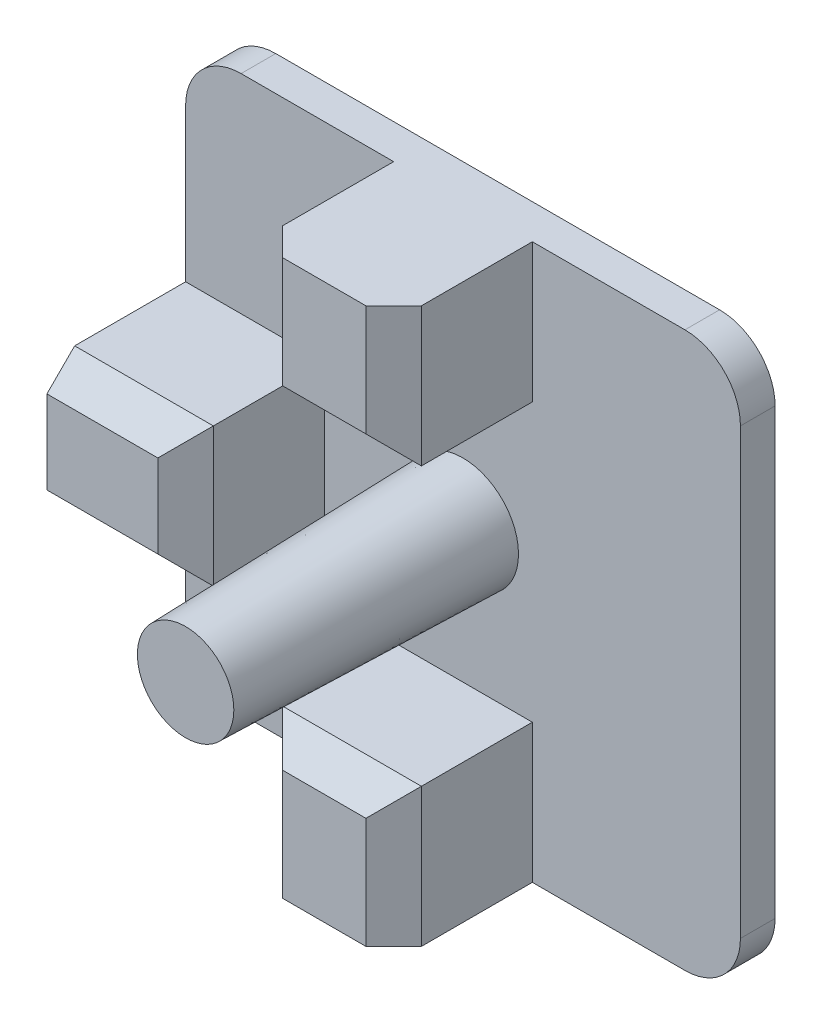
ISO-10303-21;
HEADER;
FILE_DESCRIPTION(('STEP AP214'),'2;1');
FILE_NAME('part.step','',(''),(''),'','','');
FILE_SCHEMA(('AUTOMOTIVE_DESIGN { 1 0 10303 214 1 1 1 1 }'));
ENDSEC;
DATA;
#1=APPLICATION_CONTEXT('core data for automotive mechanical design processes');
#2=APPLICATION_PROTOCOL_DEFINITION('international standard','automotive_design',2000,#1);
#3=PRODUCT_CONTEXT('',#1,'mechanical');
#4=PRODUCT('Part','Part','',(#3));
#5=PRODUCT_RELATED_PRODUCT_CATEGORY('part','',(#4));
#6=PRODUCT_DEFINITION_FORMATION('','',#4);
#7=PRODUCT_DEFINITION_CONTEXT('part definition',#1,'design');
#8=PRODUCT_DEFINITION('design','',#6,#7);
#9=PRODUCT_DEFINITION_SHAPE('','',#8);
#10=(LENGTH_UNIT() NAMED_UNIT(*) SI_UNIT(.MILLI.,.METRE.));
#11=(NAMED_UNIT(*) PLANE_ANGLE_UNIT() SI_UNIT($,.RADIAN.));
#12=(NAMED_UNIT(*) SI_UNIT($,.STERADIAN.) SOLID_ANGLE_UNIT());
#13=UNCERTAINTY_MEASURE_WITH_UNIT(LENGTH_MEASURE(1.E-05),#10,'distance_accuracy_value','');
#14=(GEOMETRIC_REPRESENTATION_CONTEXT(3) GLOBAL_UNCERTAINTY_ASSIGNED_CONTEXT((#13)) GLOBAL_UNIT_ASSIGNED_CONTEXT((#10,
#11,#12)) REPRESENTATION_CONTEXT('',''));
#15=CARTESIAN_POINT('',(0.,0.,0.));
#16=DIRECTION('',(0.,0.,1.));
#17=DIRECTION('',(1.,0.,0.));
#18=AXIS2_PLACEMENT_3D('',#15,#16,#17);
#19=CARTESIAN_POINT('',(10.16,-10.16,1.5875));
#20=DIRECTION('',(0.,0.,1.));
#21=DIRECTION('',(1.,0.,0.));
#22=AXIS2_PLACEMENT_3D('',#19,#20,#21);
#23=PLANE('',#22);
#24=CARTESIAN_POINT('',(0.,0.,1.5875));
#25=DIRECTION('',(0.,0.,1.));
#26=DIRECTION('',(1.,0.,0.));
#27=AXIS2_PLACEMENT_3D('',#24,#25,#26);
#28=CIRCLE('',#27,2.54);
#29=CARTESIAN_POINT('',(2.54,0.,1.5875));
#30=VERTEX_POINT('',#29);
#31=EDGE_CURVE('E248',#30,#30,#28,.T.);
#32=ORIENTED_EDGE('',*,*,#31,.F.);
#33=EDGE_LOOP('',(#32));
#34=FACE_BOUND('',#33,.T.);
#35=DIRECTION('',(1.,0.,0.));
#36=VECTOR('',#35,1.);
#37=CARTESIAN_POINT('',(-2.54136989230612E-13,6.35000000000014,1.5875));
#38=LINE('',#37,#36);
#39=CARTESIAN_POINT('',(-3.17499999999998,6.35000000000002,1.5875));
#40=VERTEX_POINT('',#39);
#41=CARTESIAN_POINT('',(3.17499999999991,6.35000000000027,1.5875));
#42=VERTEX_POINT('',#41);
#43=EDGE_CURVE('E242',#40,#42,#38,.T.);
#44=ORIENTED_EDGE('',*,*,#43,.F.);
#45=DIRECTION('',(0.,-1.,0.));
#46=VECTOR('',#45,1.);
#47=CARTESIAN_POINT('',(-3.17499999999987,0.,1.5875));
#48=LINE('',#47,#46);
#49=CARTESIAN_POINT('',(-3.17500000000003,12.7,1.5875));
#50=VERTEX_POINT('',#49);
#51=EDGE_CURVE('E220',#50,#40,#48,.T.);
#52=ORIENTED_EDGE('',*,*,#51,.F.);
#53=DIRECTION('',(-1.,0.,0.));
#54=VECTOR('',#53,1.);
#55=CARTESIAN_POINT('',(-10.16,12.7,1.5875));
#56=LINE('',#55,#54);
#57=CARTESIAN_POINT('',(-10.16,12.7,1.5875));
#58=VERTEX_POINT('',#57);
#59=EDGE_CURVE('E229',#50,#58,#56,.T.);
#60=ORIENTED_EDGE('',*,*,#59,.T.);
#61=CARTESIAN_POINT('',(-10.16,10.16,1.5875));
#62=DIRECTION('',(0.,0.,1.));
#63=DIRECTION('',(1.,0.,0.));
#64=AXIS2_PLACEMENT_3D('',#61,#62,#63);
#65=CIRCLE('',#64,2.54);
#66=CARTESIAN_POINT('',(-12.7,10.16,1.5875));
#67=VERTEX_POINT('',#66);
#68=EDGE_CURVE('E308',#58,#67,#65,.T.);
#69=ORIENTED_EDGE('',*,*,#68,.T.);
#70=DIRECTION('',(0.,-1.,0.));
#71=VECTOR('',#70,1.);
#72=CARTESIAN_POINT('',(-12.7,10.16,1.5875));
#73=LINE('',#72,#71);
#74=CARTESIAN_POINT('',(-12.7,3.175,1.5875));
#75=VERTEX_POINT('',#74);
#76=EDGE_CURVE('E311',#67,#75,#73,.T.);
#77=ORIENTED_EDGE('',*,*,#76,.T.);
#78=DIRECTION('',(-1.,0.,0.));
#79=VECTOR('',#78,1.);
#80=CARTESIAN_POINT('',(0.,3.175,1.5875));
#81=LINE('',#80,#79);
#82=CARTESIAN_POINT('',(-6.35,3.175,1.5875));
#83=VERTEX_POINT('',#82);
#84=EDGE_CURVE('E267',#83,#75,#81,.T.);
#85=ORIENTED_EDGE('',*,*,#84,.F.);
#86=DIRECTION('',(0.,1.,0.));
#87=VECTOR('',#86,1.);
#88=CARTESIAN_POINT('',(-6.35,0.,1.5875));
#89=LINE('',#88,#87);
#90=CARTESIAN_POINT('',(-6.35,-3.175,1.5875));
#91=VERTEX_POINT('',#90);
#92=EDGE_CURVE('E225',#91,#83,#89,.T.);
#93=ORIENTED_EDGE('',*,*,#92,.F.);
#94=DIRECTION('',(1.,0.,0.));
#95=VECTOR('',#94,1.);
#96=CARTESIAN_POINT('',(0.,-3.175,1.5875));
#97=LINE('',#96,#95);
#98=CARTESIAN_POINT('',(-12.7,-3.175,1.5875));
#99=VERTEX_POINT('',#98);
#100=EDGE_CURVE('E264',#99,#91,#97,.T.);
#101=ORIENTED_EDGE('',*,*,#100,.F.);
#102=CARTESIAN_POINT('',(-12.7,-10.16,1.5875));
#103=VERTEX_POINT('',#102);
#104=EDGE_CURVE('E310',#99,#103,#73,.T.);
#105=ORIENTED_EDGE('',*,*,#104,.T.);
#106=CARTESIAN_POINT('',(-10.16,-10.16,1.5875));
#107=DIRECTION('',(0.,0.,1.));
#108=DIRECTION('',(1.,0.,0.));
#109=AXIS2_PLACEMENT_3D('',#106,#107,#108);
#110=CIRCLE('',#109,2.54);
#111=CARTESIAN_POINT('',(-10.16,-12.7,1.5875));
#112=VERTEX_POINT('',#111);
#113=EDGE_CURVE('E314',#103,#112,#110,.T.);
#114=ORIENTED_EDGE('',*,*,#113,.T.);
#115=DIRECTION('',(1.,0.,0.));
#116=VECTOR('',#115,1.);
#117=CARTESIAN_POINT('',(-10.16,-12.7,1.5875));
#118=LINE('',#117,#116);
#119=CARTESIAN_POINT('',(-3.17499999999973,-12.7,1.5875));
#120=VERTEX_POINT('',#119);
#121=EDGE_CURVE('E317',#112,#120,#118,.T.);
#122=ORIENTED_EDGE('',*,*,#121,.T.);
#123=DIRECTION('',(0.,-1.,0.));
#124=VECTOR('',#123,1.);
#125=CARTESIAN_POINT('',(-3.17499999999973,0.,1.5875));
#126=LINE('',#125,#124);
#127=CARTESIAN_POINT('',(-3.17499999999973,-6.34999999999992,1.5875));
#128=VERTEX_POINT('',#127);
#129=EDGE_CURVE('E284',#128,#120,#126,.T.);
#130=ORIENTED_EDGE('',*,*,#129,.F.);
#131=DIRECTION('',(-1.,0.,0.));
#132=VECTOR('',#131,1.);
#133=CARTESIAN_POINT('',(0.,-6.34999999999992,1.5875));
#134=LINE('',#133,#132);
#135=CARTESIAN_POINT('',(3.17500000000027,-6.34999999999992,1.5875));
#136=VERTEX_POINT('',#135);
#137=EDGE_CURVE('E287',#136,#128,#134,.T.);
#138=ORIENTED_EDGE('',*,*,#137,.F.);
#139=DIRECTION('',(0.,1.,0.));
#140=VECTOR('',#139,1.);
#141=CARTESIAN_POINT('',(3.17500000000027,0.,1.5875));
#142=LINE('',#141,#140);
#143=CARTESIAN_POINT('',(3.17500000000027,-12.7,1.5875));
#144=VERTEX_POINT('',#143);
#145=EDGE_CURVE('E279',#144,#136,#142,.T.);
#146=ORIENTED_EDGE('',*,*,#145,.F.);
#147=CARTESIAN_POINT('',(10.16,-12.7,1.5875));
#148=VERTEX_POINT('',#147);
#149=EDGE_CURVE('E316',#144,#148,#118,.T.);
#150=ORIENTED_EDGE('',*,*,#149,.T.);
#151=CARTESIAN_POINT('',(10.16,-10.16,1.5875));
#152=DIRECTION('',(0.,0.,1.));
#153=DIRECTION('',(1.,0.,0.));
#154=AXIS2_PLACEMENT_3D('',#151,#152,#153);
#155=CIRCLE('',#154,2.54);
#156=CARTESIAN_POINT('',(12.7,-10.16,1.5875));
#157=VERTEX_POINT('',#156);
#158=EDGE_CURVE('E300',#148,#157,#155,.T.);
#159=ORIENTED_EDGE('',*,*,#158,.T.);
#160=DIRECTION('',(0.,1.,0.));
#161=VECTOR('',#160,1.);
#162=CARTESIAN_POINT('',(12.7,10.16,1.5875));
#163=LINE('',#162,#161);
#164=CARTESIAN_POINT('',(12.7,10.16,1.5875));
#165=VERTEX_POINT('',#164);
#166=EDGE_CURVE('E303',#157,#165,#163,.T.);
#167=ORIENTED_EDGE('',*,*,#166,.T.);
#168=CARTESIAN_POINT('',(10.16,10.16,1.5875));
#169=DIRECTION('',(0.,0.,1.));
#170=DIRECTION('',(-1.,0.,0.));
#171=AXIS2_PLACEMENT_3D('',#168,#169,#170);
#172=CIRCLE('',#171,2.54);
#173=CARTESIAN_POINT('',(10.16,12.7,1.5875));
#174=VERTEX_POINT('',#173);
#175=EDGE_CURVE('E237',#165,#174,#172,.T.);
#176=ORIENTED_EDGE('',*,*,#175,.T.);
#177=CARTESIAN_POINT('',(3.17499999999991,12.7,1.5875));
#178=VERTEX_POINT('',#177);
#179=EDGE_CURVE('E236',#174,#178,#56,.T.);
#180=ORIENTED_EDGE('',*,*,#179,.T.);
#181=DIRECTION('',(0.,1.,0.));
#182=VECTOR('',#181,1.);
#183=CARTESIAN_POINT('',(3.17499999999991,0.,1.5875));
#184=LINE('',#183,#182);
#185=EDGE_CURVE('E245',#42,#178,#184,.T.);
#186=ORIENTED_EDGE('',*,*,#185,.F.);
#187=EDGE_LOOP('',(#44,#52,#60,#69,#77,#85,#93,#101,#105,#114,#122,#130,#138,#146,#150,#159,
#167,#176,#180,#186));
#188=FACE_BOUND('',#187,.T.);
#189=ADVANCED_FACE('F40',(#34,#188),#23,.T.);
#190=CARTESIAN_POINT('',(10.16,-10.16,1.5875));
#191=DIRECTION('',(0.,0.,-1.));
#192=DIRECTION('',(-1.,0.,0.));
#193=AXIS2_PLACEMENT_3D('',#190,#191,#192);
#194=CYLINDRICAL_SURFACE('',#193,2.54);
#195=CARTESIAN_POINT('',(10.16,-10.16,0.));
#196=DIRECTION('',(0.,0.,1.));
#197=DIRECTION('',(1.,0.,0.));
#198=AXIS2_PLACEMENT_3D('',#195,#196,#197);
#199=CIRCLE('',#198,2.54);
#200=CARTESIAN_POINT('',(10.16,-12.7,0.));
#201=VERTEX_POINT('',#200);
#202=CARTESIAN_POINT('',(12.7,-10.16,0.));
#203=VERTEX_POINT('',#202);
#204=EDGE_CURVE('E299',#201,#203,#199,.T.);
#205=ORIENTED_EDGE('',*,*,#204,.T.);
#206=DIRECTION('',(0.,0.,-1.));
#207=VECTOR('',#206,1.);
#208=CARTESIAN_POINT('',(12.7,-10.16,1.5875));
#209=LINE('',#208,#207);
#210=EDGE_CURVE('E354',#157,#203,#209,.T.);
#211=ORIENTED_EDGE('',*,*,#210,.F.);
#212=ORIENTED_EDGE('',*,*,#158,.F.);
#213=DIRECTION('',(0.,0.,-1.));
#214=VECTOR('',#213,1.);
#215=CARTESIAN_POINT('',(10.16,-12.7,1.5875));
#216=LINE('',#215,#214);
#217=EDGE_CURVE('E320',#148,#201,#216,.T.);
#218=ORIENTED_EDGE('',*,*,#217,.T.);
#219=EDGE_LOOP('',(#205,#211,#212,#218));
#220=FACE_BOUND('',#219,.T.);
#221=ADVANCED_FACE('F458',(#220),#194,.T.);
#222=CARTESIAN_POINT('',(12.7,10.16,1.5875));
#223=DIRECTION('',(-1.,0.,0.));
#224=DIRECTION('',(0.,-1.,0.));
#225=AXIS2_PLACEMENT_3D('',#222,#223,#224);
#226=PLANE('',#225);
#227=DIRECTION('',(0.,1.,0.));
#228=VECTOR('',#227,1.);
#229=CARTESIAN_POINT('',(12.7,10.16,0.));
#230=LINE('',#229,#228);
#231=CARTESIAN_POINT('',(12.7,10.16,0.));
#232=VERTEX_POINT('',#231);
#233=EDGE_CURVE('E323',#203,#232,#230,.T.);
#234=ORIENTED_EDGE('',*,*,#233,.T.);
#235=DIRECTION('',(0.,0.,-1.));
#236=VECTOR('',#235,1.);
#237=CARTESIAN_POINT('',(12.7,10.16,1.5875));
#238=LINE('',#237,#236);
#239=EDGE_CURVE('E351',#165,#232,#238,.T.);
#240=ORIENTED_EDGE('',*,*,#239,.F.);
#241=ORIENTED_EDGE('',*,*,#166,.F.);
#242=ORIENTED_EDGE('',*,*,#210,.T.);
#243=EDGE_LOOP('',(#234,#240,#241,#242));
#244=FACE_BOUND('',#243,.T.);
#245=ADVANCED_FACE('F464',(#244),#226,.F.);
#246=CARTESIAN_POINT('',(10.16,10.16,1.5875));
#247=DIRECTION('',(0.,0.,-1.));
#248=DIRECTION('',(-1.,0.,0.));
#249=AXIS2_PLACEMENT_3D('',#246,#247,#248);
#250=CYLINDRICAL_SURFACE('',#249,2.54);
#251=CARTESIAN_POINT('',(10.16,10.16,0.));
#252=DIRECTION('',(0.,0.,1.));
#253=DIRECTION('',(-1.,0.,0.));
#254=AXIS2_PLACEMENT_3D('',#251,#252,#253);
#255=CIRCLE('',#254,2.54);
#256=CARTESIAN_POINT('',(10.16,12.7,0.));
#257=VERTEX_POINT('',#256);
#258=EDGE_CURVE('E325',#232,#257,#255,.T.);
#259=ORIENTED_EDGE('',*,*,#258,.T.);
#260=DIRECTION('',(0.,0.,-1.));
#261=VECTOR('',#260,1.);
#262=CARTESIAN_POINT('',(10.16,12.7,1.5875));
#263=LINE('',#262,#261);
#264=EDGE_CURVE('E348',#174,#257,#263,.T.);
#265=ORIENTED_EDGE('',*,*,#264,.F.);
#266=ORIENTED_EDGE('',*,*,#175,.F.);
#267=ORIENTED_EDGE('',*,*,#239,.T.);
#268=EDGE_LOOP('',(#259,#265,#266,#267));
#269=FACE_BOUND('',#268,.T.);
#270=ADVANCED_FACE('F491',(#269),#250,.T.);
#271=CARTESIAN_POINT('',(-10.16,12.7,1.5875));
#272=DIRECTION('',(0.,-1.,0.));
#273=DIRECTION('',(0.,0.,-1.));
#274=AXIS2_PLACEMENT_3D('',#271,#272,#273);
#275=PLANE('',#274);
#276=DIRECTION('',(-1.,0.,0.));
#277=VECTOR('',#276,1.);
#278=CARTESIAN_POINT('',(0.,12.7,7.9375));
#279=LINE('',#278,#277);
#280=CARTESIAN_POINT('',(1.90499999999991,12.7,7.9375));
#281=VERTEX_POINT('',#280);
#282=CARTESIAN_POINT('',(-1.90500000000009,12.7,7.9375));
#283=VERTEX_POINT('',#282);
#284=EDGE_CURVE('E251',#281,#283,#279,.T.);
#285=ORIENTED_EDGE('',*,*,#284,.F.);
#286=DIRECTION('',(0.707106781186547,0.,-0.707106781186548));
#287=VECTOR('',#286,1.);
#288=CARTESIAN_POINT('',(1.90499999999991,12.7,7.9375));
#289=LINE('',#288,#287);
#290=CARTESIAN_POINT('',(3.17499999999991,12.7,6.6675));
#291=VERTEX_POINT('',#290);
#292=EDGE_CURVE('E366',#281,#291,#289,.T.);
#293=ORIENTED_EDGE('',*,*,#292,.T.);
#294=DIRECTION('',(0.,0.,-1.));
#295=VECTOR('',#294,1.);
#296=CARTESIAN_POINT('',(3.17499999999991,12.7,7.9375));
#297=LINE('',#296,#295);
#298=EDGE_CURVE('E255',#291,#178,#297,.T.);
#299=ORIENTED_EDGE('',*,*,#298,.T.);
#300=ORIENTED_EDGE('',*,*,#179,.F.);
#301=ORIENTED_EDGE('',*,*,#264,.T.);
#302=DIRECTION('',(-1.,0.,0.));
#303=VECTOR('',#302,1.);
#304=CARTESIAN_POINT('',(-10.16,12.7,0.));
#305=LINE('',#304,#303);
#306=CARTESIAN_POINT('',(-10.16,12.7,0.));
#307=VERTEX_POINT('',#306);
#308=EDGE_CURVE('E327',#257,#307,#305,.T.);
#309=ORIENTED_EDGE('',*,*,#308,.T.);
#310=DIRECTION('',(0.,0.,-1.));
#311=VECTOR('',#310,1.);
#312=CARTESIAN_POINT('',(-10.16,12.7,1.5875));
#313=LINE('',#312,#311);
#314=EDGE_CURVE('E233',#58,#307,#313,.T.);
#315=ORIENTED_EDGE('',*,*,#314,.F.);
#316=ORIENTED_EDGE('',*,*,#59,.F.);
#317=DIRECTION('',(0.,0.,-1.));
#318=VECTOR('',#317,1.);
#319=CARTESIAN_POINT('',(-3.17500000000003,12.7,7.9375));
#320=LINE('',#319,#318);
#321=CARTESIAN_POINT('',(-3.17500000000003,12.7,6.6675));
#322=VERTEX_POINT('',#321);
#323=EDGE_CURVE('E215',#322,#50,#320,.T.);
#324=ORIENTED_EDGE('',*,*,#323,.F.);
#325=DIRECTION('',(0.707106781186547,0.,0.707106781186548));
#326=VECTOR('',#325,1.);
#327=CARTESIAN_POINT('',(-1.90499999999998,12.7,7.93750000000011));
#328=LINE('',#327,#326);
#329=EDGE_CURVE('E364',#322,#283,#328,.T.);
#330=ORIENTED_EDGE('',*,*,#329,.T.);
#331=EDGE_LOOP('',(#285,#293,#299,#300,#301,#309,#315,#316,#324,#330));
#332=FACE_BOUND('',#331,.T.);
#333=ADVANCED_FACE('F231',(#332),#275,.F.);
#334=CARTESIAN_POINT('',(-10.16,10.16,1.5875));
#335=DIRECTION('',(0.,0.,-1.));
#336=DIRECTION('',(-1.,0.,0.));
#337=AXIS2_PLACEMENT_3D('',#334,#335,#336);
#338=CYLINDRICAL_SURFACE('',#337,2.54);
#339=CARTESIAN_POINT('',(-10.16,10.16,0.));
#340=DIRECTION('',(0.,0.,1.));
#341=DIRECTION('',(1.,0.,0.));
#342=AXIS2_PLACEMENT_3D('',#339,#340,#341);
#343=CIRCLE('',#342,2.54);
#344=CARTESIAN_POINT('',(-12.7,10.16,0.));
#345=VERTEX_POINT('',#344);
#346=EDGE_CURVE('E329',#307,#345,#343,.T.);
#347=ORIENTED_EDGE('',*,*,#346,.T.);
#348=DIRECTION('',(0.,0.,-1.));
#349=VECTOR('',#348,1.);
#350=CARTESIAN_POINT('',(-12.7,10.16,1.5875));
#351=LINE('',#350,#349);
#352=EDGE_CURVE('E344',#67,#345,#351,.T.);
#353=ORIENTED_EDGE('',*,*,#352,.F.);
#354=ORIENTED_EDGE('',*,*,#68,.F.);
#355=ORIENTED_EDGE('',*,*,#314,.T.);
#356=EDGE_LOOP('',(#347,#353,#354,#355));
#357=FACE_BOUND('',#356,.T.);
#358=ADVANCED_FACE('F484',(#357),#338,.T.);
#359=CARTESIAN_POINT('',(-12.7,10.16,1.5875));
#360=DIRECTION('',(1.,0.,0.));
#361=DIRECTION('',(0.,1.,0.));
#362=AXIS2_PLACEMENT_3D('',#359,#360,#361);
#363=PLANE('',#362);
#364=DIRECTION('',(0.,0.,-1.));
#365=VECTOR('',#364,1.);
#366=CARTESIAN_POINT('',(-12.7,-3.175,7.9375));
#367=LINE('',#366,#365);
#368=CARTESIAN_POINT('',(-12.7,-3.175,6.6675));
#369=VERTEX_POINT('',#368);
#370=EDGE_CURVE('E273',#369,#99,#367,.T.);
#371=ORIENTED_EDGE('',*,*,#370,.F.);
#372=DIRECTION('',(0.,0.707106781186547,0.707106781186548));
#373=VECTOR('',#372,1.);
#374=CARTESIAN_POINT('',(-12.7,-1.905,7.9375));
#375=LINE('',#374,#373);
#376=CARTESIAN_POINT('',(-12.7,-1.905,7.9375));
#377=VERTEX_POINT('',#376);
#378=EDGE_CURVE('E384',#369,#377,#375,.T.);
#379=ORIENTED_EDGE('',*,*,#378,.T.);
#380=DIRECTION('',(0.,-1.,0.));
#381=VECTOR('',#380,1.);
#382=CARTESIAN_POINT('',(-12.7,0.,7.9375));
#383=LINE('',#382,#381);
#384=CARTESIAN_POINT('',(-12.7,1.905,7.9375));
#385=VERTEX_POINT('',#384);
#386=EDGE_CURVE('E260',#385,#377,#383,.T.);
#387=ORIENTED_EDGE('',*,*,#386,.F.);
#388=DIRECTION('',(0.,0.707106781186547,-0.707106781186548));
#389=VECTOR('',#388,1.);
#390=CARTESIAN_POINT('',(-12.7,1.905,7.9375));
#391=LINE('',#390,#389);
#392=CARTESIAN_POINT('',(-12.7,3.175,6.6675));
#393=VERTEX_POINT('',#392);
#394=EDGE_CURVE('E382',#385,#393,#391,.T.);
#395=ORIENTED_EDGE('',*,*,#394,.T.);
#396=DIRECTION('',(0.,0.,-1.));
#397=VECTOR('',#396,1.);
#398=CARTESIAN_POINT('',(-12.7,3.175,7.9375));
#399=LINE('',#398,#397);
#400=EDGE_CURVE('E275',#393,#75,#399,.T.);
#401=ORIENTED_EDGE('',*,*,#400,.T.);
#402=ORIENTED_EDGE('',*,*,#76,.F.);
#403=ORIENTED_EDGE('',*,*,#352,.T.);
#404=DIRECTION('',(0.,-1.,0.));
#405=VECTOR('',#404,1.);
#406=CARTESIAN_POINT('',(-12.7,10.16,0.));
#407=LINE('',#406,#405);
#408=CARTESIAN_POINT('',(-12.7,-10.16,0.));
#409=VERTEX_POINT('',#408);
#410=EDGE_CURVE('E331',#345,#409,#407,.T.);
#411=ORIENTED_EDGE('',*,*,#410,.T.);
#412=DIRECTION('',(0.,0.,-1.));
#413=VECTOR('',#412,1.);
#414=CARTESIAN_POINT('',(-12.7,-10.16,1.5875));
#415=LINE('',#414,#413);
#416=EDGE_CURVE('E341',#103,#409,#415,.T.);
#417=ORIENTED_EDGE('',*,*,#416,.F.);
#418=ORIENTED_EDGE('',*,*,#104,.F.);
#419=EDGE_LOOP('',(#371,#379,#387,#395,#401,#402,#403,#411,#417,#418));
#420=FACE_BOUND('',#419,.T.);
#421=ADVANCED_FACE('F480',(#420),#363,.F.);
#422=CARTESIAN_POINT('',(-10.16,-10.16,1.5875));
#423=DIRECTION('',(0.,0.,-1.));
#424=DIRECTION('',(-1.,0.,0.));
#425=AXIS2_PLACEMENT_3D('',#422,#423,#424);
#426=CYLINDRICAL_SURFACE('',#425,2.54);
#427=CARTESIAN_POINT('',(-10.16,-10.16,0.));
#428=DIRECTION('',(0.,0.,1.));
#429=DIRECTION('',(1.,0.,0.));
#430=AXIS2_PLACEMENT_3D('',#427,#428,#429);
#431=CIRCLE('',#430,2.54);
#432=CARTESIAN_POINT('',(-10.16,-12.7,0.));
#433=VERTEX_POINT('',#432);
#434=EDGE_CURVE('E333',#409,#433,#431,.T.);
#435=ORIENTED_EDGE('',*,*,#434,.T.);
#436=DIRECTION('',(0.,0.,-1.));
#437=VECTOR('',#436,1.);
#438=CARTESIAN_POINT('',(-10.16,-12.7,1.5875));
#439=LINE('',#438,#437);
#440=EDGE_CURVE('E338',#112,#433,#439,.T.);
#441=ORIENTED_EDGE('',*,*,#440,.F.);
#442=ORIENTED_EDGE('',*,*,#113,.F.);
#443=ORIENTED_EDGE('',*,*,#416,.T.);
#444=EDGE_LOOP('',(#435,#441,#442,#443));
#445=FACE_BOUND('',#444,.T.);
#446=ADVANCED_FACE('F477',(#445),#426,.T.);
#447=CARTESIAN_POINT('',(-10.16,-12.7,1.5875));
#448=DIRECTION('',(0.,1.,0.));
#449=DIRECTION('',(0.,0.,1.));
#450=AXIS2_PLACEMENT_3D('',#447,#448,#449);
#451=PLANE('',#450);
#452=DIRECTION('',(1.,0.,0.));
#453=VECTOR('',#452,1.);
#454=CARTESIAN_POINT('',(0.,-12.7,7.9375));
#455=LINE('',#454,#453);
#456=CARTESIAN_POINT('',(-1.90499999999973,-12.7,7.9375));
#457=VERTEX_POINT('',#456);
#458=CARTESIAN_POINT('',(1.90500000000027,-12.7,7.9375));
#459=VERTEX_POINT('',#458);
#460=EDGE_CURVE('E280',#457,#459,#455,.T.);
#461=ORIENTED_EDGE('',*,*,#460,.F.);
#462=DIRECTION('',(-0.707106781186547,0.,-0.707106781186548));
#463=VECTOR('',#462,1.);
#464=CARTESIAN_POINT('',(-1.90499999999973,-12.7,7.9375));
#465=LINE('',#464,#463);
#466=CARTESIAN_POINT('',(-3.17499999999973,-12.7,6.6675));
#467=VERTEX_POINT('',#466);
#468=EDGE_CURVE('E399',#457,#467,#465,.T.);
#469=ORIENTED_EDGE('',*,*,#468,.T.);
#470=DIRECTION('',(0.,0.,-1.));
#471=VECTOR('',#470,1.);
#472=CARTESIAN_POINT('',(-3.17499999999973,-12.7,7.9375));
#473=LINE('',#472,#471);
#474=EDGE_CURVE('E283',#467,#120,#473,.T.);
#475=ORIENTED_EDGE('',*,*,#474,.T.);
#476=ORIENTED_EDGE('',*,*,#121,.F.);
#477=ORIENTED_EDGE('',*,*,#440,.T.);
#478=DIRECTION('',(1.,0.,0.));
#479=VECTOR('',#478,1.);
#480=CARTESIAN_POINT('',(-10.16,-12.7,0.));
#481=LINE('',#480,#479);
#482=EDGE_CURVE('E304',#433,#201,#481,.T.);
#483=ORIENTED_EDGE('',*,*,#482,.T.);
#484=ORIENTED_EDGE('',*,*,#217,.F.);
#485=ORIENTED_EDGE('',*,*,#149,.F.);
#486=DIRECTION('',(0.,0.,-1.));
#487=VECTOR('',#486,1.);
#488=CARTESIAN_POINT('',(3.17500000000027,-12.7,7.9375));
#489=LINE('',#488,#487);
#490=CARTESIAN_POINT('',(3.17500000000027,-12.7,6.6675));
#491=VERTEX_POINT('',#490);
#492=EDGE_CURVE('E297',#491,#144,#489,.T.);
#493=ORIENTED_EDGE('',*,*,#492,.F.);
#494=DIRECTION('',(-0.707106781186547,0.,0.707106781186548));
#495=VECTOR('',#494,1.);
#496=CARTESIAN_POINT('',(1.90500000000027,-12.7,7.9375));
#497=LINE('',#496,#495);
#498=EDGE_CURVE('E397',#491,#459,#497,.T.);
#499=ORIENTED_EDGE('',*,*,#498,.T.);
#500=EDGE_LOOP('',(#461,#469,#475,#476,#477,#483,#484,#485,#493,#499));
#501=FACE_BOUND('',#500,.T.);
#502=ADVANCED_FACE('F434',(#501),#451,.F.);
#503=CARTESIAN_POINT('',(10.16,-10.16,0.));
#504=DIRECTION('',(0.,0.,1.));
#505=DIRECTION('',(1.,0.,0.));
#506=AXIS2_PLACEMENT_3D('',#503,#504,#505);
#507=PLANE('',#506);
#508=ORIENTED_EDGE('',*,*,#204,.F.);
#509=ORIENTED_EDGE('',*,*,#482,.F.);
#510=ORIENTED_EDGE('',*,*,#434,.F.);
#511=ORIENTED_EDGE('',*,*,#410,.F.);
#512=ORIENTED_EDGE('',*,*,#346,.F.);
#513=ORIENTED_EDGE('',*,*,#308,.F.);
#514=ORIENTED_EDGE('',*,*,#258,.F.);
#515=ORIENTED_EDGE('',*,*,#233,.F.);
#516=EDGE_LOOP('',(#508,#509,#510,#511,#512,#513,#514,#515));
#517=FACE_BOUND('',#516,.T.);
#518=ADVANCED_FACE('F471',(#517),#507,.F.);
#519=CARTESIAN_POINT('',(3.17500000000027,0.,7.9375));
#520=DIRECTION('',(-1.,0.,0.));
#521=DIRECTION('',(0.,-1.,0.));
#522=AXIS2_PLACEMENT_3D('',#519,#520,#521);
#523=PLANE('',#522);
#524=DIRECTION('',(0.,0.,-1.));
#525=VECTOR('',#524,1.);
#526=CARTESIAN_POINT('',(3.17500000000027,-6.34999999999992,7.9375));
#527=LINE('',#526,#525);
#528=CARTESIAN_POINT('',(3.17500000000027,-6.34999999999992,6.6675));
#529=VERTEX_POINT('',#528);
#530=EDGE_CURVE('E295',#529,#136,#527,.T.);
#531=ORIENTED_EDGE('',*,*,#530,.F.);
#532=DIRECTION('',(0.,-1.,0.));
#533=VECTOR('',#532,1.);
#534=CARTESIAN_POINT('',(3.17500000000027,-12.7,6.6675));
#535=LINE('',#534,#533);
#536=EDGE_CURVE('E50',#529,#491,#535,.T.);
#537=ORIENTED_EDGE('',*,*,#536,.T.);
#538=ORIENTED_EDGE('',*,*,#492,.T.);
#539=ORIENTED_EDGE('',*,*,#145,.T.);
#540=EDGE_LOOP('',(#531,#537,#538,#539));
#541=FACE_BOUND('',#540,.T.);
#542=ADVANCED_FACE('F429',(#541),#523,.F.);
#543=CARTESIAN_POINT('',(0.,-6.34999999999992,7.9375));
#544=DIRECTION('',(0.,-1.,0.));
#545=DIRECTION('',(1.,0.,0.));
#546=AXIS2_PLACEMENT_3D('',#543,#544,#545);
#547=PLANE('',#546);
#548=DIRECTION('',(0.,0.,-1.));
#549=VECTOR('',#548,1.);
#550=CARTESIAN_POINT('',(-3.17499999999973,-6.34999999999992,7.9375));
#551=LINE('',#550,#549);
#552=CARTESIAN_POINT('',(-3.17499999999973,-6.34999999999992,6.6675));
#553=VERTEX_POINT('',#552);
#554=EDGE_CURVE('E293',#553,#128,#551,.T.);
#555=ORIENTED_EDGE('',*,*,#554,.F.);
#556=DIRECTION('',(1.,0.,0.));
#557=VECTOR('',#556,1.);
#558=CARTESIAN_POINT('',(3.17500000000027,-6.34999999999992,6.6675));
#559=LINE('',#558,#557);
#560=EDGE_CURVE('E11',#553,#529,#559,.T.);
#561=ORIENTED_EDGE('',*,*,#560,.T.);
#562=ORIENTED_EDGE('',*,*,#530,.T.);
#563=ORIENTED_EDGE('',*,*,#137,.T.);
#564=EDGE_LOOP('',(#555,#561,#562,#563));
#565=FACE_BOUND('',#564,.T.);
#566=ADVANCED_FACE('F440',(#565),#547,.F.);
#567=CARTESIAN_POINT('',(-3.17499999999973,0.,7.9375));
#568=DIRECTION('',(1.,0.,0.));
#569=DIRECTION('',(0.,1.,0.));
#570=AXIS2_PLACEMENT_3D('',#567,#568,#569);
#571=PLANE('',#570);
#572=ORIENTED_EDGE('',*,*,#474,.F.);
#573=DIRECTION('',(0.,1.,0.));
#574=VECTOR('',#573,1.);
#575=CARTESIAN_POINT('',(-3.17499999999973,-6.34999999999992,6.6675));
#576=LINE('',#575,#574);
#577=EDGE_CURVE('E64',#467,#553,#576,.T.);
#578=ORIENTED_EDGE('',*,*,#577,.T.);
#579=ORIENTED_EDGE('',*,*,#554,.T.);
#580=ORIENTED_EDGE('',*,*,#129,.T.);
#581=EDGE_LOOP('',(#572,#578,#579,#580));
#582=FACE_BOUND('',#581,.T.);
#583=ADVANCED_FACE('F441',(#582),#571,.F.);
#584=CARTESIAN_POINT('',(0.,0.,7.9375));
#585=DIRECTION('',(0.,0.,1.));
#586=DIRECTION('',(1.,0.,0.));
#587=AXIS2_PLACEMENT_3D('',#584,#585,#586);
#588=PLANE('',#587);
#589=DIRECTION('',(-1.,0.,0.));
#590=VECTOR('',#589,1.);
#591=CARTESIAN_POINT('',(-3.17499999999973,-7.61999999999992,7.9375));
#592=LINE('',#591,#590);
#593=CARTESIAN_POINT('',(1.90500000000027,-7.61999999999992,7.9375));
#594=VERTEX_POINT('',#593);
#595=CARTESIAN_POINT('',(-1.90499999999973,-7.61999999999992,7.9375));
#596=VERTEX_POINT('',#595);
#597=EDGE_CURVE('E390',#594,#596,#592,.T.);
#598=ORIENTED_EDGE('',*,*,#597,.T.);
#599=DIRECTION('',(0.,-1.,0.));
#600=VECTOR('',#599,1.);
#601=CARTESIAN_POINT('',(-1.90499999999973,-12.7,7.9375));
#602=LINE('',#601,#600);
#603=EDGE_CURVE('E394',#596,#457,#602,.T.);
#604=ORIENTED_EDGE('',*,*,#603,.T.);
#605=ORIENTED_EDGE('',*,*,#460,.T.);
#606=DIRECTION('',(0.,1.,0.));
#607=VECTOR('',#606,1.);
#608=CARTESIAN_POINT('',(1.90500000000027,-6.34999999999992,7.9375));
#609=LINE('',#608,#607);
#610=EDGE_CURVE('E392',#459,#594,#609,.T.);
#611=ORIENTED_EDGE('',*,*,#610,.T.);
#612=EDGE_LOOP('',(#598,#604,#605,#611));
#613=FACE_BOUND('',#612,.T.);
#614=ADVANCED_FACE('F445',(#613),#588,.T.);
#615=CARTESIAN_POINT('',(-6.35,0.,7.9375));
#616=DIRECTION('',(-1.,0.,0.));
#617=DIRECTION('',(0.,0.,1.));
#618=AXIS2_PLACEMENT_3D('',#615,#616,#617);
#619=PLANE('',#618);
#620=DIRECTION('',(0.,0.,-1.));
#621=VECTOR('',#620,1.);
#622=CARTESIAN_POINT('',(-6.35,3.175,7.9375));
#623=LINE('',#622,#621);
#624=CARTESIAN_POINT('',(-6.35,3.175,6.6675));
#625=VERTEX_POINT('',#624);
#626=EDGE_CURVE('E277',#625,#83,#623,.T.);
#627=ORIENTED_EDGE('',*,*,#626,.F.);
#628=DIRECTION('',(0.,-1.,0.));
#629=VECTOR('',#628,1.);
#630=CARTESIAN_POINT('',(-6.35,-3.175,6.6675));
#631=LINE('',#630,#629);
#632=CARTESIAN_POINT('',(-6.35,-3.175,6.6675));
#633=VERTEX_POINT('',#632);
#634=EDGE_CURVE('E388',#625,#633,#631,.T.);
#635=ORIENTED_EDGE('',*,*,#634,.T.);
#636=DIRECTION('',(0.,0.,-1.));
#637=VECTOR('',#636,1.);
#638=CARTESIAN_POINT('',(-6.35,-3.175,7.9375));
#639=LINE('',#638,#637);
#640=EDGE_CURVE('E263',#633,#91,#639,.T.);
#641=ORIENTED_EDGE('',*,*,#640,.T.);
#642=ORIENTED_EDGE('',*,*,#92,.T.);
#643=EDGE_LOOP('',(#627,#635,#641,#642));
#644=FACE_BOUND('',#643,.T.);
#645=ADVANCED_FACE('F447',(#644),#619,.F.);
#646=CARTESIAN_POINT('',(0.,3.175,7.9375));
#647=DIRECTION('',(0.,-1.,0.));
#648=DIRECTION('',(1.,0.,0.));
#649=AXIS2_PLACEMENT_3D('',#646,#647,#648);
#650=PLANE('',#649);
#651=ORIENTED_EDGE('',*,*,#400,.F.);
#652=DIRECTION('',(1.,0.,0.));
#653=VECTOR('',#652,1.);
#654=CARTESIAN_POINT('',(-6.35,3.175,6.6675));
#655=LINE('',#654,#653);
#656=EDGE_CURVE('E386',#393,#625,#655,.T.);
#657=ORIENTED_EDGE('',*,*,#656,.T.);
#658=ORIENTED_EDGE('',*,*,#626,.T.);
#659=ORIENTED_EDGE('',*,*,#84,.T.);
#660=EDGE_LOOP('',(#651,#657,#658,#659));
#661=FACE_BOUND('',#660,.T.);
#662=ADVANCED_FACE('F453',(#661),#650,.F.);
#663=CARTESIAN_POINT('',(0.,-3.175,7.9375));
#664=DIRECTION('',(0.,1.,0.));
#665=DIRECTION('',(0.,0.,1.));
#666=AXIS2_PLACEMENT_3D('',#663,#664,#665);
#667=PLANE('',#666);
#668=ORIENTED_EDGE('',*,*,#640,.F.);
#669=DIRECTION('',(-1.,0.,0.));
#670=VECTOR('',#669,1.);
#671=CARTESIAN_POINT('',(-12.7,-3.175,6.6675));
#672=LINE('',#671,#670);
#673=EDGE_CURVE('E380',#633,#369,#672,.T.);
#674=ORIENTED_EDGE('',*,*,#673,.T.);
#675=ORIENTED_EDGE('',*,*,#370,.T.);
#676=ORIENTED_EDGE('',*,*,#100,.T.);
#677=EDGE_LOOP('',(#668,#674,#675,#676));
#678=FACE_BOUND('',#677,.T.);
#679=ADVANCED_FACE('F631',(#678),#667,.F.);
#680=CARTESIAN_POINT('',(0.,0.,7.9375));
#681=DIRECTION('',(0.,0.,1.));
#682=DIRECTION('',(1.,0.,0.));
#683=AXIS2_PLACEMENT_3D('',#680,#681,#682);
#684=PLANE('',#683);
#685=ORIENTED_EDGE('',*,*,#386,.T.);
#686=DIRECTION('',(1.,0.,0.));
#687=VECTOR('',#686,1.);
#688=CARTESIAN_POINT('',(-6.35,-1.905,7.9375));
#689=LINE('',#688,#687);
#690=CARTESIAN_POINT('',(-7.62,-1.905,7.9375));
#691=VERTEX_POINT('',#690);
#692=EDGE_CURVE('E377',#377,#691,#689,.T.);
#693=ORIENTED_EDGE('',*,*,#692,.T.);
#694=DIRECTION('',(0.,1.,0.));
#695=VECTOR('',#694,1.);
#696=CARTESIAN_POINT('',(-7.62,3.175,7.9375));
#697=LINE('',#696,#695);
#698=CARTESIAN_POINT('',(-7.62,1.905,7.9375));
#699=VERTEX_POINT('',#698);
#700=EDGE_CURVE('E373',#691,#699,#697,.T.);
#701=ORIENTED_EDGE('',*,*,#700,.T.);
#702=DIRECTION('',(-1.,0.,0.));
#703=VECTOR('',#702,1.);
#704=CARTESIAN_POINT('',(-12.7,1.905,7.9375));
#705=LINE('',#704,#703);
#706=EDGE_CURVE('E375',#699,#385,#705,.T.);
#707=ORIENTED_EDGE('',*,*,#706,.T.);
#708=EDGE_LOOP('',(#685,#693,#701,#707));
#709=FACE_BOUND('',#708,.T.);
#710=ADVANCED_FACE('F624',(#709),#684,.T.);
#711=CARTESIAN_POINT('',(-3.17499999999987,0.,7.9375));
#712=DIRECTION('',(1.,0.,0.));
#713=DIRECTION('',(0.,1.,0.));
#714=AXIS2_PLACEMENT_3D('',#711,#712,#713);
#715=PLANE('',#714);
#716=DIRECTION('',(0.,0.,-1.));
#717=VECTOR('',#716,1.);
#718=CARTESIAN_POINT('',(-3.17499999999998,6.35000000000002,7.9375));
#719=LINE('',#718,#717);
#720=CARTESIAN_POINT('',(-3.17499999999998,6.35000000000002,6.6675));
#721=VERTEX_POINT('',#720);
#722=EDGE_CURVE('E226',#721,#40,#719,.T.);
#723=ORIENTED_EDGE('',*,*,#722,.F.);
#724=DIRECTION('',(0.,1.,0.));
#725=VECTOR('',#724,1.);
#726=CARTESIAN_POINT('',(-3.17500000000009,12.7,6.6675));
#727=LINE('',#726,#725);
#728=EDGE_CURVE('E222',#721,#322,#727,.T.);
#729=ORIENTED_EDGE('',*,*,#728,.T.);
#730=ORIENTED_EDGE('',*,*,#323,.T.);
#731=ORIENTED_EDGE('',*,*,#51,.T.);
#732=EDGE_LOOP('',(#723,#729,#730,#731));
#733=FACE_BOUND('',#732,.T.);
#734=ADVANCED_FACE('F218',(#733),#715,.F.);
#735=CARTESIAN_POINT('',(-2.54136989230612E-13,6.35000000000014,7.9375));
#736=DIRECTION('',(0.,1.,0.));
#737=DIRECTION('',(-1.,0.,0.));
#738=AXIS2_PLACEMENT_3D('',#735,#736,#737);
#739=PLANE('',#738);
#740=DIRECTION('',(0.,0.,-1.));
#741=VECTOR('',#740,1.);
#742=CARTESIAN_POINT('',(3.17499999999991,6.35000000000027,7.9375));
#743=LINE('',#742,#741);
#744=CARTESIAN_POINT('',(3.17499999999991,6.35000000000027,6.6675));
#745=VERTEX_POINT('',#744);
#746=EDGE_CURVE('E257',#745,#42,#743,.T.);
#747=ORIENTED_EDGE('',*,*,#746,.F.);
#748=DIRECTION('',(-1.,0.,0.));
#749=VECTOR('',#748,1.);
#750=CARTESIAN_POINT('',(-3.17499999999998,6.35000000000002,6.6675));
#751=LINE('',#750,#749);
#752=EDGE_CURVE('E371',#745,#721,#751,.T.);
#753=ORIENTED_EDGE('',*,*,#752,.T.);
#754=ORIENTED_EDGE('',*,*,#722,.T.);
#755=ORIENTED_EDGE('',*,*,#43,.T.);
#756=EDGE_LOOP('',(#747,#753,#754,#755));
#757=FACE_BOUND('',#756,.T.);
#758=ADVANCED_FACE('F609',(#757),#739,.F.);
#759=CARTESIAN_POINT('',(3.17499999999991,0.,7.9375));
#760=DIRECTION('',(-1.,0.,0.));
#761=DIRECTION('',(0.,-1.,0.));
#762=AXIS2_PLACEMENT_3D('',#759,#760,#761);
#763=PLANE('',#762);
#764=ORIENTED_EDGE('',*,*,#298,.F.);
#765=DIRECTION('',(0.,-1.,0.));
#766=VECTOR('',#765,1.);
#767=CARTESIAN_POINT('',(3.17499999999991,6.35000000000027,6.6675));
#768=LINE('',#767,#766);
#769=EDGE_CURVE('E368',#291,#745,#768,.T.);
#770=ORIENTED_EDGE('',*,*,#769,.T.);
#771=ORIENTED_EDGE('',*,*,#746,.T.);
#772=ORIENTED_EDGE('',*,*,#185,.T.);
#773=EDGE_LOOP('',(#764,#770,#771,#772));
#774=FACE_BOUND('',#773,.T.);
#775=ADVANCED_FACE('F601',(#774),#763,.F.);
#776=CARTESIAN_POINT('',(0.,0.,7.9375));
#777=DIRECTION('',(0.,0.,1.));
#778=DIRECTION('',(1.,0.,0.));
#779=AXIS2_PLACEMENT_3D('',#776,#777,#778);
#780=PLANE('',#779);
#781=DIRECTION('',(1.,0.,0.));
#782=VECTOR('',#781,1.);
#783=CARTESIAN_POINT('',(3.17499999999986,7.62000000000027,7.9375));
#784=LINE('',#783,#782);
#785=CARTESIAN_POINT('',(-1.905,7.62000000000007,7.9375));
#786=VERTEX_POINT('',#785);
#787=CARTESIAN_POINT('',(1.90499999999991,7.62000000000022,7.9375));
#788=VERTEX_POINT('',#787);
#789=EDGE_CURVE('E357',#786,#788,#784,.T.);
#790=ORIENTED_EDGE('',*,*,#789,.T.);
#791=DIRECTION('',(0.,1.,0.));
#792=VECTOR('',#791,1.);
#793=CARTESIAN_POINT('',(1.90499999999991,12.7,7.9375));
#794=LINE('',#793,#792);
#795=EDGE_CURVE('E361',#788,#281,#794,.T.);
#796=ORIENTED_EDGE('',*,*,#795,.T.);
#797=ORIENTED_EDGE('',*,*,#284,.T.);
#798=DIRECTION('',(0.,-1.,0.));
#799=VECTOR('',#798,1.);
#800=CARTESIAN_POINT('',(-1.90499999999998,6.35000000000004,7.9375));
#801=LINE('',#800,#799);
#802=EDGE_CURVE('E359',#283,#786,#801,.T.);
#803=ORIENTED_EDGE('',*,*,#802,.T.);
#804=EDGE_LOOP('',(#790,#796,#797,#803));
#805=FACE_BOUND('',#804,.T.);
#806=ADVANCED_FACE('F594',(#805),#780,.T.);
#807=CARTESIAN_POINT('',(0.,0.,1.5875));
#808=DIRECTION('',(0.,0.,-1.));
#809=DIRECTION('',(1.,0.,0.));
#810=AXIS2_PLACEMENT_3D('',#807,#808,#809);
#811=CONICAL_SURFACE('',#810,2.54,0.026179938779915);
#812=CARTESIAN_POINT('',(0.,0.,14.2875));
#813=DIRECTION('',(0.,0.,1.));
#814=DIRECTION('',(1.,0.,0.));
#815=AXIS2_PLACEMENT_3D('',#812,#813,#814);
#816=CIRCLE('',#815,2.20743879607133);
#817=CARTESIAN_POINT('',(2.20743879607133,0.,14.2875));
#818=VERTEX_POINT('',#817);
#819=EDGE_CURVE('E243',#818,#818,#816,.T.);
#820=ORIENTED_EDGE('',*,*,#819,.F.);
#821=EDGE_LOOP('',(#820));
#822=FACE_BOUND('',#821,.T.);
#823=ORIENTED_EDGE('',*,*,#31,.T.);
#824=EDGE_LOOP('',(#823));
#825=FACE_BOUND('',#824,.T.);
#826=ADVANCED_FACE('F585',(#822,#825),#811,.T.);
#827=CARTESIAN_POINT('',(0.,0.,14.2875));
#828=DIRECTION('',(0.,0.,1.));
#829=DIRECTION('',(1.,0.,0.));
#830=AXIS2_PLACEMENT_3D('',#827,#828,#829);
#831=PLANE('',#830);
#832=ORIENTED_EDGE('',*,*,#819,.T.);
#833=EDGE_LOOP('',(#832));
#834=FACE_BOUND('',#833,.T.);
#835=ADVANCED_FACE('F520',(#834),#831,.T.);
#836=CARTESIAN_POINT('',(-1.90499999999987,0.,7.9375));
#837=DIRECTION('',(-0.707106781186548,0.,0.707106781186547));
#838=DIRECTION('',(0.,1.,0.));
#839=AXIS2_PLACEMENT_3D('',#836,#837,#838);
#840=PLANE('',#839);
#841=ORIENTED_EDGE('',*,*,#329,.F.);
#842=ORIENTED_EDGE('',*,*,#728,.F.);
#843=DIRECTION('',(-0.577350269189611,-0.577350269189644,-0.577350269189622));
#844=VECTOR('',#843,1.);
#845=CARTESIAN_POINT('',(-1.27000000000011,8.25499999999999,8.57249999999991));
#846=LINE('',#845,#844);
#847=EDGE_CURVE('E406',#786,#721,#846,.T.);
#848=ORIENTED_EDGE('',*,*,#847,.F.);
#849=ORIENTED_EDGE('',*,*,#802,.F.);
#850=EDGE_LOOP('',(#841,#842,#848,#849));
#851=FACE_BOUND('',#850,.T.);
#852=ADVANCED_FACE('F514',(#851),#840,.T.);
#853=CARTESIAN_POINT('',(-3.04964387076733E-13,7.62000000000014,7.9375));
#854=DIRECTION('',(0.,-0.707106781186548,0.707106781186547));
#855=DIRECTION('',(-1.,0.,0.));
#856=AXIS2_PLACEMENT_3D('',#853,#854,#855);
#857=PLANE('',#856);
#858=ORIENTED_EDGE('',*,*,#847,.T.);
#859=ORIENTED_EDGE('',*,*,#752,.F.);
#860=DIRECTION('',(-0.577350269189633,0.57735026918961,0.577350269189635));
#861=VECTOR('',#860,1.);
#862=CARTESIAN_POINT('',(1.26999999999985,8.25500000000026,8.57250000000006));
#863=LINE('',#862,#861);
#864=EDGE_CURVE('E403',#788,#745,#863,.F.);
#865=ORIENTED_EDGE('',*,*,#864,.F.);
#866=ORIENTED_EDGE('',*,*,#789,.F.);
#867=EDGE_LOOP('',(#858,#859,#865,#866));
#868=FACE_BOUND('',#867,.T.);
#869=ADVANCED_FACE('F507',(#868),#857,.T.);
#870=CARTESIAN_POINT('',(1.90499999999991,0.,7.9375));
#871=DIRECTION('',(0.707106781186548,0.,0.707106781186547));
#872=DIRECTION('',(0.,-1.,0.));
#873=AXIS2_PLACEMENT_3D('',#870,#871,#872);
#874=PLANE('',#873);
#875=ORIENTED_EDGE('',*,*,#864,.T.);
#876=ORIENTED_EDGE('',*,*,#769,.F.);
#877=ORIENTED_EDGE('',*,*,#292,.F.);
#878=ORIENTED_EDGE('',*,*,#795,.F.);
#879=EDGE_LOOP('',(#875,#876,#877,#878));
#880=FACE_BOUND('',#879,.T.);
#881=ADVANCED_FACE('F499',(#880),#874,.T.);
#882=CARTESIAN_POINT('',(0.,1.905,7.9375));
#883=DIRECTION('',(0.,0.707106781186548,0.707106781186547));
#884=DIRECTION('',(1.,0.,0.));
#885=AXIS2_PLACEMENT_3D('',#882,#883,#884);
#886=PLANE('',#885);
#887=ORIENTED_EDGE('',*,*,#394,.F.);
#888=ORIENTED_EDGE('',*,*,#706,.F.);
#889=DIRECTION('',(-0.577350269189625,-0.577350269189625,0.577350269189627));
#890=VECTOR('',#889,1.);
#891=CARTESIAN_POINT('',(-8.255,1.27,8.5725));
#892=LINE('',#891,#890);
#893=EDGE_CURVE('E407',#625,#699,#892,.T.);
#894=ORIENTED_EDGE('',*,*,#893,.F.);
#895=ORIENTED_EDGE('',*,*,#656,.F.);
#896=EDGE_LOOP('',(#887,#888,#894,#895));
#897=FACE_BOUND('',#896,.T.);
#898=ADVANCED_FACE('F506',(#897),#886,.T.);
#899=CARTESIAN_POINT('',(-7.62,0.,7.9375));
#900=DIRECTION('',(0.707106781186548,0.,0.707106781186547));
#901=DIRECTION('',(0.,-1.,0.));
#902=AXIS2_PLACEMENT_3D('',#899,#900,#901);
#903=PLANE('',#902);
#904=ORIENTED_EDGE('',*,*,#893,.T.);
#905=ORIENTED_EDGE('',*,*,#700,.F.);
#906=DIRECTION('',(0.577350269189625,-0.577350269189625,-0.577350269189627));
#907=VECTOR('',#906,1.);
#908=CARTESIAN_POINT('',(-8.255,-1.27,8.5725));
#909=LINE('',#908,#907);
#910=EDGE_CURVE('E410',#633,#691,#909,.F.);
#911=ORIENTED_EDGE('',*,*,#910,.F.);
#912=ORIENTED_EDGE('',*,*,#634,.F.);
#913=EDGE_LOOP('',(#904,#905,#911,#912));
#914=FACE_BOUND('',#913,.T.);
#915=ADVANCED_FACE('F529',(#914),#903,.T.);
#916=CARTESIAN_POINT('',(0.,-1.905,7.9375));
#917=DIRECTION('',(0.,-0.707106781186548,0.707106781186547));
#918=DIRECTION('',(-1.,0.,0.));
#919=AXIS2_PLACEMENT_3D('',#916,#917,#918);
#920=PLANE('',#919);
#921=ORIENTED_EDGE('',*,*,#378,.F.);
#922=ORIENTED_EDGE('',*,*,#673,.F.);
#923=ORIENTED_EDGE('',*,*,#910,.T.);
#924=ORIENTED_EDGE('',*,*,#692,.F.);
#925=EDGE_LOOP('',(#921,#922,#923,#924));
#926=FACE_BOUND('',#925,.T.);
#927=ADVANCED_FACE('F523',(#926),#920,.T.);
#928=CARTESIAN_POINT('',(1.90500000000027,0.,7.9375));
#929=DIRECTION('',(0.707106781186548,0.,0.707106781186547));
#930=DIRECTION('',(0.,-1.,0.));
#931=AXIS2_PLACEMENT_3D('',#928,#929,#930);
#932=PLANE('',#931);
#933=ORIENTED_EDGE('',*,*,#498,.F.);
#934=ORIENTED_EDGE('',*,*,#536,.F.);
#935=DIRECTION('',(0.577350269189625,0.577350269189625,-0.577350269189627));
#936=VECTOR('',#935,1.);
#937=CARTESIAN_POINT('',(1.27000000000018,-8.25500000000001,8.57250000000009));
#938=LINE('',#937,#936);
#939=EDGE_CURVE('E45',#594,#529,#938,.T.);
#940=ORIENTED_EDGE('',*,*,#939,.F.);
#941=ORIENTED_EDGE('',*,*,#610,.F.);
#942=EDGE_LOOP('',(#933,#934,#940,#941));
#943=FACE_BOUND('',#942,.T.);
#944=ADVANCED_FACE('F43',(#943),#932,.T.);
#945=CARTESIAN_POINT('',(0.,-7.61999999999992,7.9375));
#946=DIRECTION('',(0.,0.707106781186548,0.707106781186547));
#947=DIRECTION('',(1.,0.,0.));
#948=AXIS2_PLACEMENT_3D('',#945,#946,#947);
#949=PLANE('',#948);
#950=ORIENTED_EDGE('',*,*,#939,.T.);
#951=ORIENTED_EDGE('',*,*,#560,.F.);
#952=DIRECTION('',(0.577350269189626,-0.577350269189625,0.577350269189627));
#953=VECTOR('',#952,1.);
#954=CARTESIAN_POINT('',(-1.26999999999982,-8.25499999999983,8.57249999999991));
#955=LINE('',#954,#953);
#956=EDGE_CURVE('E413',#596,#553,#955,.F.);
#957=ORIENTED_EDGE('',*,*,#956,.F.);
#958=ORIENTED_EDGE('',*,*,#597,.F.);
#959=EDGE_LOOP('',(#950,#951,#957,#958));
#960=FACE_BOUND('',#959,.T.);
#961=ADVANCED_FACE('F422',(#960),#949,.T.);
#962=CARTESIAN_POINT('',(-1.90499999999973,0.,7.9375));
#963=DIRECTION('',(-0.707106781186548,0.,0.707106781186547));
#964=DIRECTION('',(0.,1.,0.));
#965=AXIS2_PLACEMENT_3D('',#962,#963,#964);
#966=PLANE('',#965);
#967=ORIENTED_EDGE('',*,*,#956,.T.);
#968=ORIENTED_EDGE('',*,*,#577,.F.);
#969=ORIENTED_EDGE('',*,*,#468,.F.);
#970=ORIENTED_EDGE('',*,*,#603,.F.);
#971=EDGE_LOOP('',(#967,#968,#969,#970));
#972=FACE_BOUND('',#971,.T.);
#973=ADVANCED_FACE('F443',(#972),#966,.T.);
#974=CLOSED_SHELL('',(#189,#221,#245,#270,#333,#358,#421,#446,#502,#518,#542,#566,#583,#614,
#645,#662,#679,#710,#734,#758,#775,#806,#826,#835,#852,#869,#881,#898,#915,#927,#944,#961,#973));
#975=MANIFOLD_SOLID_BREP('B2',#974);
#976=ADVANCED_BREP_SHAPE_REPRESENTATION('',(#18,#975),#14);
#977=SHAPE_DEFINITION_REPRESENTATION(#9,#976);
ENDSEC;
END-ISO-10303-21;
